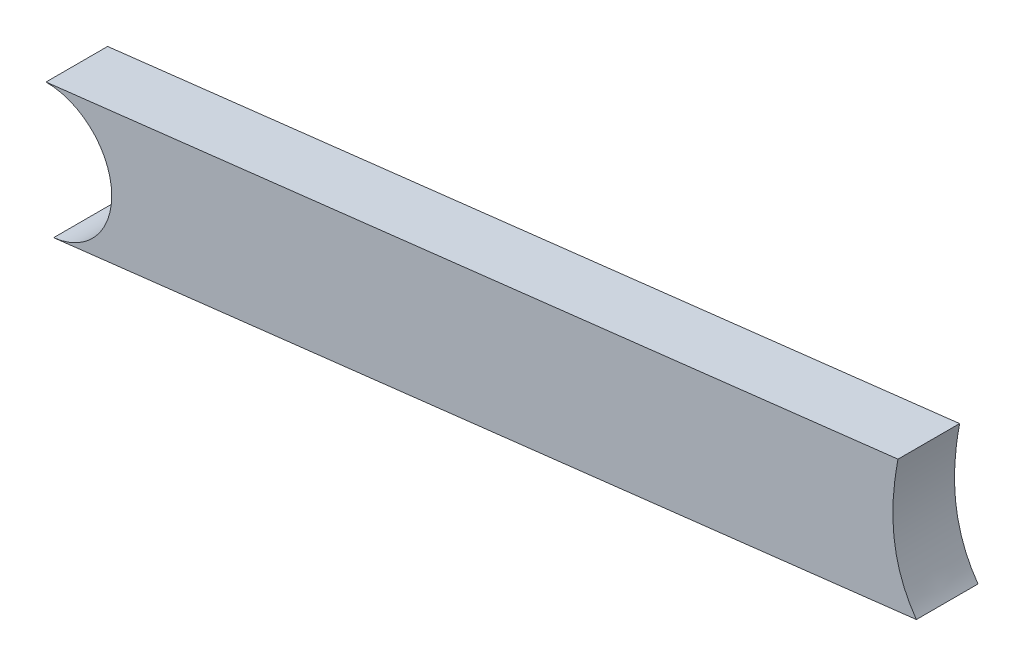
ISO-10303-21;
HEADER;
FILE_DESCRIPTION(('STEP AP214'),'2;1');
FILE_NAME('part.step','',(''),(''),'','','');
FILE_SCHEMA(('AUTOMOTIVE_DESIGN { 1 0 10303 214 1 1 1 1 }'));
ENDSEC;
DATA;
#1=APPLICATION_CONTEXT('core data for automotive mechanical design processes');
#2=APPLICATION_PROTOCOL_DEFINITION('international standard','automotive_design',2000,#1);
#3=PRODUCT_CONTEXT('',#1,'mechanical');
#4=PRODUCT('Part','Part','',(#3));
#5=PRODUCT_RELATED_PRODUCT_CATEGORY('part','',(#4));
#6=PRODUCT_DEFINITION_FORMATION('','',#4);
#7=PRODUCT_DEFINITION_CONTEXT('part definition',#1,'design');
#8=PRODUCT_DEFINITION('design','',#6,#7);
#9=PRODUCT_DEFINITION_SHAPE('','',#8);
#10=(LENGTH_UNIT() NAMED_UNIT(*) SI_UNIT(.MILLI.,.METRE.));
#11=(NAMED_UNIT(*) PLANE_ANGLE_UNIT() SI_UNIT($,.RADIAN.));
#12=(NAMED_UNIT(*) SI_UNIT($,.STERADIAN.) SOLID_ANGLE_UNIT());
#13=UNCERTAINTY_MEASURE_WITH_UNIT(LENGTH_MEASURE(1.E-05),#10,'distance_accuracy_value','');
#14=(GEOMETRIC_REPRESENTATION_CONTEXT(3) GLOBAL_UNCERTAINTY_ASSIGNED_CONTEXT((#13)) GLOBAL_UNIT_ASSIGNED_CONTEXT((#10,
#11,#12)) REPRESENTATION_CONTEXT('',''));
#15=CARTESIAN_POINT('',(0.,0.,0.));
#16=DIRECTION('',(0.,0.,1.));
#17=DIRECTION('',(1.,0.,0.));
#18=AXIS2_PLACEMENT_3D('',#15,#16,#17);
#19=CARTESIAN_POINT('',(0.,47.2744,-3.));
#20=DIRECTION('',(0.,0.,1.));
#21=DIRECTION('',(1.,0.,0.));
#22=AXIS2_PLACEMENT_3D('',#19,#20,#21);
#23=CYLINDRICAL_SURFACE('',#22,3.2);
#24=CARTESIAN_POINT('',(0.,47.2744,0.));
#25=DIRECTION('',(0.,0.,-1.));
#26=DIRECTION('',(1.,0.,0.));
#27=AXIS2_PLACEMENT_3D('',#24,#25,#26);
#28=CIRCLE('',#27,3.2);
#29=CARTESIAN_POINT('',(0.,50.4744,0.));
#30=VERTEX_POINT('',#29);
#31=CARTESIAN_POINT('',(0.370789206930645,44.095954568028,0.));
#32=VERTEX_POINT('',#31);
#33=EDGE_CURVE('E129',#30,#32,#28,.T.);
#34=ORIENTED_EDGE('',*,*,#33,.F.);
#35=DIRECTION('',(0.,0.,1.));
#36=VECTOR('',#35,1.);
#37=CARTESIAN_POINT('',(0.,50.4744,-3.));
#38=LINE('',#37,#36);
#39=CARTESIAN_POINT('',(0.,50.4744,-3.));
#40=VERTEX_POINT('',#39);
#41=EDGE_CURVE('E11',#40,#30,#38,.T.);
#42=ORIENTED_EDGE('',*,*,#41,.F.);
#43=CARTESIAN_POINT('',(0.,47.2744,-3.));
#44=DIRECTION('',(0.,0.,-1.));
#45=DIRECTION('',(1.,0.,0.));
#46=AXIS2_PLACEMENT_3D('',#43,#44,#45);
#47=CIRCLE('',#46,3.2);
#48=CARTESIAN_POINT('',(0.370789206930645,44.095954568028,-3.));
#49=VERTEX_POINT('',#48);
#50=EDGE_CURVE('E101',#40,#49,#47,.T.);
#51=ORIENTED_EDGE('',*,*,#50,.T.);
#52=DIRECTION('',(0.,0.,1.));
#53=VECTOR('',#52,1.);
#54=CARTESIAN_POINT('',(0.370789206930645,44.095954568028,-3.));
#55=LINE('',#54,#53);
#56=EDGE_CURVE('E46',#49,#32,#55,.T.);
#57=ORIENTED_EDGE('',*,*,#56,.T.);
#58=EDGE_LOOP('',(#34,#42,#51,#57));
#59=FACE_BOUND('',#58,.T.);
#60=ADVANCED_FACE('F43',(#59),#23,.F.);
#61=CARTESIAN_POINT('',(0.,50.4744,-3.));
#62=DIRECTION('',(-0.115871627165831,0.993264197491253,0.));
#63=DIRECTION('',(-0.993264197491253,-0.115871627165831,0.));
#64=AXIS2_PLACEMENT_3D('',#61,#62,#63);
#65=PLANE('',#64);
#66=DIRECTION('',(-0.993264197491253,-0.115871627165831,0.));
#67=VECTOR('',#66,1.);
#68=CARTESIAN_POINT('',(0.,50.4744,0.));
#69=LINE('',#68,#67);
#70=CARTESIAN_POINT('',(41.4837304480028,55.3137844860809,0.));
#71=VERTEX_POINT('',#70);
#72=EDGE_CURVE('E103',#71,#30,#69,.T.);
#73=ORIENTED_EDGE('',*,*,#72,.F.);
#74=DIRECTION('',(0.,0.,1.));
#75=VECTOR('',#74,1.);
#76=CARTESIAN_POINT('',(41.4837304480028,55.3137844860809,-3.));
#77=LINE('',#76,#75);
#78=CARTESIAN_POINT('',(41.4837304480028,55.3137844860809,-3.));
#79=VERTEX_POINT('',#78);
#80=EDGE_CURVE('E52',#79,#71,#77,.T.);
#81=ORIENTED_EDGE('',*,*,#80,.F.);
#82=DIRECTION('',(-0.993264197491253,-0.115871627165831,0.));
#83=VECTOR('',#82,1.);
#84=CARTESIAN_POINT('',(0.,50.4744,-3.));
#85=LINE('',#84,#83);
#86=EDGE_CURVE('E98',#79,#40,#85,.T.);
#87=ORIENTED_EDGE('',*,*,#86,.T.);
#88=ORIENTED_EDGE('',*,*,#41,.T.);
#89=EDGE_LOOP('',(#73,#81,#87,#88));
#90=FACE_BOUND('',#89,.T.);
#91=ADVANCED_FACE('F116',(#90),#65,.T.);
#92=CARTESIAN_POINT('',(42.3790759655582,48.9965324338821,-3.));
#93=CARTESIAN_POINT('',(40.8597592650577,51.112442986573,-3.));
#94=CARTESIAN_POINT('',(41.1893559984308,53.7106665553466,-3.));
#95=CARTESIAN_POINT('',(41.4837304480028,55.3137844860809,-3.));
#96=B_SPLINE_CURVE_WITH_KNOTS('',3,(#92,#93,#94,#95),.UNSPECIFIED.,.F.,.F.,(4,4),(0.,1.),.UNSPECIFIED.);
#97=DIRECTION('',(0.,0.,1.));
#98=VECTOR('',#97,1.);
#99=SURFACE_OF_LINEAR_EXTRUSION('',#96,#98);
#100=CARTESIAN_POINT('',(42.3790759655582,48.9965324338821,0.));
#101=CARTESIAN_POINT('',(40.8597592650577,51.112442986573,0.));
#102=CARTESIAN_POINT('',(41.1893559984308,53.7106665553466,0.));
#103=CARTESIAN_POINT('',(41.4837304480028,55.3137844860809,0.));
#104=B_SPLINE_CURVE_WITH_KNOTS('',3,(#100,#101,#102,#103),.UNSPECIFIED.,.F.,.F.,(4,4),(0.,1.),.UNSPECIFIED.);
#105=CARTESIAN_POINT('',(42.3790759655582,48.9965324338821,0.));
#106=VERTEX_POINT('',#105);
#107=EDGE_CURVE('E93',#106,#71,#104,.T.);
#108=ORIENTED_EDGE('',*,*,#107,.F.);
#109=DIRECTION('',(0.,0.,1.));
#110=VECTOR('',#109,1.);
#111=CARTESIAN_POINT('',(42.3790759655582,48.9965324338821,-3.));
#112=LINE('',#111,#110);
#113=CARTESIAN_POINT('',(42.3790759655582,48.9965324338821,-3.));
#114=VERTEX_POINT('',#113);
#115=EDGE_CURVE('E88',#114,#106,#112,.T.);
#116=ORIENTED_EDGE('',*,*,#115,.F.);
#117=EDGE_CURVE('E91',#114,#79,#96,.T.);
#118=ORIENTED_EDGE('',*,*,#117,.T.);
#119=ORIENTED_EDGE('',*,*,#80,.T.);
#120=EDGE_LOOP('',(#108,#116,#118,#119));
#121=FACE_BOUND('',#120,.T.);
#122=ADVANCED_FACE('F90',(#121),#99,.T.);
#123=CARTESIAN_POINT('',(0.370789206930645,44.095954568028,-3.));
#124=DIRECTION('',(0.115871627165831,-0.993264197491253,0.));
#125=DIRECTION('',(0.993264197491253,0.115871627165831,0.));
#126=AXIS2_PLACEMENT_3D('',#123,#124,#125);
#127=PLANE('',#126);
#128=DIRECTION('',(0.993264197491253,0.115871627165831,0.));
#129=VECTOR('',#128,1.);
#130=CARTESIAN_POINT('',(0.370789206930645,44.095954568028,0.));
#131=LINE('',#130,#129);
#132=EDGE_CURVE('E132',#32,#106,#131,.T.);
#133=ORIENTED_EDGE('',*,*,#132,.F.);
#134=ORIENTED_EDGE('',*,*,#56,.F.);
#135=DIRECTION('',(0.993264197491253,0.115871627165831,0.));
#136=VECTOR('',#135,1.);
#137=CARTESIAN_POINT('',(0.370789206930645,44.095954568028,-3.));
#138=LINE('',#137,#136);
#139=EDGE_CURVE('E97',#49,#114,#138,.T.);
#140=ORIENTED_EDGE('',*,*,#139,.T.);
#141=ORIENTED_EDGE('',*,*,#115,.T.);
#142=EDGE_LOOP('',(#133,#134,#140,#141));
#143=FACE_BOUND('',#142,.T.);
#144=ADVANCED_FACE('F100',(#143),#127,.T.);
#145=CARTESIAN_POINT('',(0.,47.2744,-3.));
#146=DIRECTION('',(0.,0.,1.));
#147=DIRECTION('',(1.,0.,0.));
#148=AXIS2_PLACEMENT_3D('',#145,#146,#147);
#149=PLANE('',#148);
#150=ORIENTED_EDGE('',*,*,#50,.F.);
#151=ORIENTED_EDGE('',*,*,#86,.F.);
#152=ORIENTED_EDGE('',*,*,#117,.F.);
#153=ORIENTED_EDGE('',*,*,#139,.F.);
#154=EDGE_LOOP('',(#150,#151,#152,#153));
#155=FACE_BOUND('',#154,.T.);
#156=ADVANCED_FACE('F96',(#155),#149,.F.);
#157=CARTESIAN_POINT('',(0.,47.2744,0.));
#158=DIRECTION('',(0.,0.,1.));
#159=DIRECTION('',(1.,0.,0.));
#160=AXIS2_PLACEMENT_3D('',#157,#158,#159);
#161=PLANE('',#160);
#162=ORIENTED_EDGE('',*,*,#33,.T.);
#163=ORIENTED_EDGE('',*,*,#132,.T.);
#164=ORIENTED_EDGE('',*,*,#107,.T.);
#165=ORIENTED_EDGE('',*,*,#72,.T.);
#166=EDGE_LOOP('',(#162,#163,#164,#165));
#167=FACE_BOUND('',#166,.T.);
#168=ADVANCED_FACE('F122',(#167),#161,.T.);
#169=CLOSED_SHELL('',(#60,#91,#122,#144,#156,#168));
#170=MANIFOLD_SOLID_BREP('B2',#169);
#171=ADVANCED_BREP_SHAPE_REPRESENTATION('',(#18,#170),#14);
#172=SHAPE_DEFINITION_REPRESENTATION(#9,#171);
ENDSEC;
END-ISO-10303-21;
